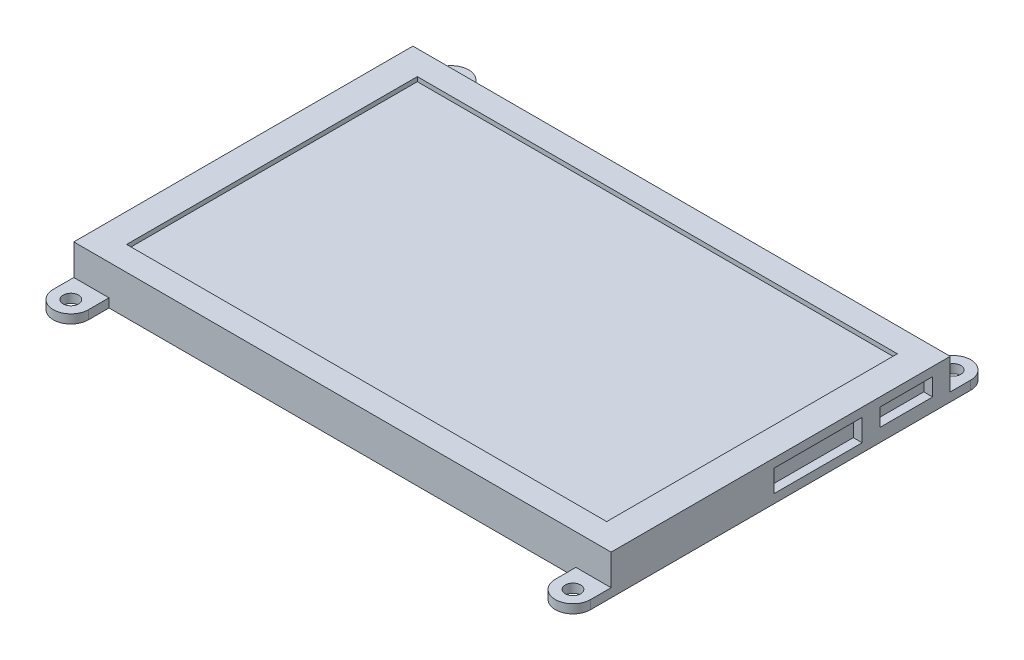
ISO-10303-21;
HEADER;
FILE_DESCRIPTION(('STEP AP214'),'2;1');
FILE_NAME('part.step','',(''),(''),'','','');
FILE_SCHEMA(('AUTOMOTIVE_DESIGN { 1 0 10303 214 1 1 1 1 }'));
ENDSEC;
DATA;
#1=APPLICATION_CONTEXT('core data for automotive mechanical design processes');
#2=APPLICATION_PROTOCOL_DEFINITION('international standard','automotive_design',2000,#1);
#3=PRODUCT_CONTEXT('',#1,'mechanical');
#4=PRODUCT('Part','Part','',(#3));
#5=PRODUCT_RELATED_PRODUCT_CATEGORY('part','',(#4));
#6=PRODUCT_DEFINITION_FORMATION('','',#4);
#7=PRODUCT_DEFINITION_CONTEXT('part definition',#1,'design');
#8=PRODUCT_DEFINITION('design','',#6,#7);
#9=PRODUCT_DEFINITION_SHAPE('','',#8);
#10=(LENGTH_UNIT() NAMED_UNIT(*) SI_UNIT(.MILLI.,.METRE.));
#11=(NAMED_UNIT(*) PLANE_ANGLE_UNIT() SI_UNIT($,.RADIAN.));
#12=(NAMED_UNIT(*) SI_UNIT($,.STERADIAN.) SOLID_ANGLE_UNIT());
#13=UNCERTAINTY_MEASURE_WITH_UNIT(LENGTH_MEASURE(1.E-05),#10,'distance_accuracy_value','');
#14=(GEOMETRIC_REPRESENTATION_CONTEXT(3) GLOBAL_UNCERTAINTY_ASSIGNED_CONTEXT((#13)) GLOBAL_UNIT_ASSIGNED_CONTEXT((#10,
#11,#12)) REPRESENTATION_CONTEXT('',''));
#15=CARTESIAN_POINT('',(0.,0.,0.));
#16=DIRECTION('',(0.,0.,1.));
#17=DIRECTION('',(1.,0.,0.));
#18=AXIS2_PLACEMENT_3D('',#15,#16,#17);
#19=CARTESIAN_POINT('',(0.,0.,0.));
#20=DIRECTION('',(0.,-1.,0.));
#21=DIRECTION('',(0.,0.,-1.));
#22=AXIS2_PLACEMENT_3D('',#19,#20,#21);
#23=PLANE('',#22);
#24=CARTESIAN_POINT('',(118.,0.,4.66000000000003));
#25=DIRECTION('',(0.,-1.,0.));
#26=DIRECTION('',(0.,0.,-1.));
#27=AXIS2_PLACEMENT_3D('',#24,#25,#26);
#28=CIRCLE('',#27,1.75);
#29=CARTESIAN_POINT('',(118.,0.,2.91000000000003));
#30=VERTEX_POINT('',#29);
#31=EDGE_CURVE('E289',#30,#30,#28,.T.);
#32=ORIENTED_EDGE('',*,*,#31,.F.);
#33=EDGE_LOOP('',(#32));
#34=FACE_BOUND('',#33,.T.);
#35=CARTESIAN_POINT('',(118.,0.,-81.66));
#36=DIRECTION('',(0.,-1.,0.));
#37=DIRECTION('',(0.,0.,1.));
#38=AXIS2_PLACEMENT_3D('',#35,#36,#37);
#39=CIRCLE('',#38,4.);
#40=CARTESIAN_POINT('',(114.,0.,-81.66));
#41=VERTEX_POINT('',#40);
#42=CARTESIAN_POINT('',(122.,0.,-81.66));
#43=VERTEX_POINT('',#42);
#44=EDGE_CURVE('E348',#41,#43,#39,.T.);
#45=ORIENTED_EDGE('',*,*,#44,.T.);
#46=DIRECTION('',(0.,0.,-1.));
#47=VECTOR('',#46,1.);
#48=CARTESIAN_POINT('',(122.,0.,0.));
#49=LINE('',#48,#47);
#50=CARTESIAN_POINT('',(122.,0.,4.66));
#51=VERTEX_POINT('',#50);
#52=EDGE_CURVE('E439',#51,#43,#49,.T.);
#53=ORIENTED_EDGE('',*,*,#52,.F.);
#54=CARTESIAN_POINT('',(118.,0.,4.65999999999999));
#55=DIRECTION('',(0.,-1.,0.));
#56=DIRECTION('',(0.,0.,-1.));
#57=AXIS2_PLACEMENT_3D('',#54,#55,#56);
#58=CIRCLE('',#57,4.);
#59=CARTESIAN_POINT('',(114.,0.,4.66));
#60=VERTEX_POINT('',#59);
#61=EDGE_CURVE('E312',#51,#60,#58,.T.);
#62=ORIENTED_EDGE('',*,*,#61,.T.);
#63=DIRECTION('',(0.,0.,-1.));
#64=VECTOR('',#63,1.);
#65=CARTESIAN_POINT('',(114.,0.,4.66));
#66=LINE('',#65,#64);
#67=CARTESIAN_POINT('',(114.,0.,0.));
#68=VERTEX_POINT('',#67);
#69=EDGE_CURVE('E306',#60,#68,#66,.T.);
#70=ORIENTED_EDGE('',*,*,#69,.T.);
#71=DIRECTION('',(1.,0.,0.));
#72=VECTOR('',#71,1.);
#73=CARTESIAN_POINT('',(0.,0.,0.));
#74=LINE('',#73,#72);
#75=CARTESIAN_POINT('',(8.,0.,0.));
#76=VERTEX_POINT('',#75);
#77=EDGE_CURVE('E427',#76,#68,#74,.T.);
#78=ORIENTED_EDGE('',*,*,#77,.F.);
#79=DIRECTION('',(0.,0.,1.));
#80=VECTOR('',#79,1.);
#81=CARTESIAN_POINT('',(8.,0.,4.66));
#82=LINE('',#81,#80);
#83=CARTESIAN_POINT('',(8.,0.,4.66));
#84=VERTEX_POINT('',#83);
#85=EDGE_CURVE('E331',#76,#84,#82,.T.);
#86=ORIENTED_EDGE('',*,*,#85,.T.);
#87=CARTESIAN_POINT('',(4.,0.,4.66));
#88=DIRECTION('',(0.,-1.,0.));
#89=DIRECTION('',(0.,0.,1.));
#90=AXIS2_PLACEMENT_3D('',#87,#88,#89);
#91=CIRCLE('',#90,4.);
#92=CARTESIAN_POINT('',(0.,0.,4.66));
#93=VERTEX_POINT('',#92);
#94=EDGE_CURVE('E326',#84,#93,#91,.T.);
#95=ORIENTED_EDGE('',*,*,#94,.T.);
#96=DIRECTION('',(0.,0.,-1.));
#97=VECTOR('',#96,1.);
#98=CARTESIAN_POINT('',(0.,0.,0.));
#99=LINE('',#98,#97);
#100=CARTESIAN_POINT('',(0.,0.,-81.66));
#101=VERTEX_POINT('',#100);
#102=EDGE_CURVE('E416',#93,#101,#99,.T.);
#103=ORIENTED_EDGE('',*,*,#102,.T.);
#104=CARTESIAN_POINT('',(4.,0.,-81.66));
#105=DIRECTION('',(0.,-1.,0.));
#106=DIRECTION('',(0.,0.,-1.));
#107=AXIS2_PLACEMENT_3D('',#104,#105,#106);
#108=CIRCLE('',#107,4.);
#109=CARTESIAN_POINT('',(8.00000000000001,0.,-81.66));
#110=VERTEX_POINT('',#109);
#111=EDGE_CURVE('E369',#101,#110,#108,.T.);
#112=ORIENTED_EDGE('',*,*,#111,.T.);
#113=DIRECTION('',(0.,0.,1.));
#114=VECTOR('',#113,1.);
#115=CARTESIAN_POINT('',(8.00000000000001,0.,-81.66));
#116=LINE('',#115,#114);
#117=CARTESIAN_POINT('',(8.,0.,-77.));
#118=VERTEX_POINT('',#117);
#119=EDGE_CURVE('E374',#110,#118,#116,.T.);
#120=ORIENTED_EDGE('',*,*,#119,.T.);
#121=DIRECTION('',(1.,0.,0.));
#122=VECTOR('',#121,1.);
#123=CARTESIAN_POINT('',(0.,0.,-77.));
#124=LINE('',#123,#122);
#125=CARTESIAN_POINT('',(114.,0.,-77.));
#126=VERTEX_POINT('',#125);
#127=EDGE_CURVE('E436',#118,#126,#124,.T.);
#128=ORIENTED_EDGE('',*,*,#127,.T.);
#129=DIRECTION('',(0.,0.,-1.));
#130=VECTOR('',#129,1.);
#131=CARTESIAN_POINT('',(114.,0.,-81.66));
#132=LINE('',#131,#130);
#133=EDGE_CURVE('E353',#126,#41,#132,.T.);
#134=ORIENTED_EDGE('',*,*,#133,.T.);
#135=EDGE_LOOP('',(#45,#53,#62,#70,#78,#86,#95,#103,#112,#120,#128,#134));
#136=FACE_BOUND('',#135,.T.);
#137=CARTESIAN_POINT('',(118.,0.,-81.66));
#138=DIRECTION('',(0.,1.,0.));
#139=DIRECTION('',(0.,0.,1.));
#140=AXIS2_PLACEMENT_3D('',#137,#138,#139);
#141=CIRCLE('',#140,1.75);
#142=CARTESIAN_POINT('',(118.,0.,-79.91));
#143=VERTEX_POINT('',#142);
#144=EDGE_CURVE('E298',#143,#143,#141,.T.);
#145=ORIENTED_EDGE('',*,*,#144,.T.);
#146=EDGE_LOOP('',(#145));
#147=FACE_BOUND('',#146,.T.);
#148=CARTESIAN_POINT('',(4.,0.,-81.66));
#149=DIRECTION('',(0.,-1.,0.));
#150=DIRECTION('',(0.,0.,-1.));
#151=AXIS2_PLACEMENT_3D('',#148,#149,#150);
#152=CIRCLE('',#151,1.75);
#153=CARTESIAN_POINT('',(4.,0.,-83.41));
#154=VERTEX_POINT('',#153);
#155=EDGE_CURVE('E283',#154,#154,#152,.T.);
#156=ORIENTED_EDGE('',*,*,#155,.F.);
#157=EDGE_LOOP('',(#156));
#158=FACE_BOUND('',#157,.T.);
#159=CARTESIAN_POINT('',(4.,0.,4.66));
#160=DIRECTION('',(0.,1.,0.));
#161=DIRECTION('',(0.,0.,1.));
#162=AXIS2_PLACEMENT_3D('',#159,#160,#161);
#163=CIRCLE('',#162,1.75);
#164=CARTESIAN_POINT('',(4.,0.,6.41));
#165=VERTEX_POINT('',#164);
#166=EDGE_CURVE('E293',#165,#165,#163,.T.);
#167=ORIENTED_EDGE('',*,*,#166,.T.);
#168=EDGE_LOOP('',(#167));
#169=FACE_BOUND('',#168,.T.);
#170=ADVANCED_FACE('F34',(#34,#136,#147,#158,#169),#23,.T.);
#171=CARTESIAN_POINT('',(0.,9.,0.));
#172=DIRECTION('',(-1.,0.,0.));
#173=DIRECTION('',(0.,0.,1.));
#174=AXIS2_PLACEMENT_3D('',#171,#172,#173);
#175=PLANE('',#174);
#176=DIRECTION('',(0.,-1.,0.));
#177=VECTOR('',#176,1.);
#178=CARTESIAN_POINT('',(0.,2.,-81.66));
#179=LINE('',#178,#177);
#180=CARTESIAN_POINT('',(0.,2.,-81.66));
#181=VERTEX_POINT('',#180);
#182=EDGE_CURVE('E383',#181,#101,#179,.T.);
#183=ORIENTED_EDGE('',*,*,#182,.T.);
#184=ORIENTED_EDGE('',*,*,#102,.F.);
#185=DIRECTION('',(0.,-1.,0.));
#186=VECTOR('',#185,1.);
#187=CARTESIAN_POINT('',(0.,2.,4.66));
#188=LINE('',#187,#186);
#189=CARTESIAN_POINT('',(0.,2.,4.66));
#190=VERTEX_POINT('',#189);
#191=EDGE_CURVE('E336',#190,#93,#188,.T.);
#192=ORIENTED_EDGE('',*,*,#191,.F.);
#193=DIRECTION('',(0.,0.,-1.));
#194=VECTOR('',#193,1.);
#195=CARTESIAN_POINT('',(0.,2.,4.66));
#196=LINE('',#195,#194);
#197=CARTESIAN_POINT('',(0.,2.,0.));
#198=VERTEX_POINT('',#197);
#199=EDGE_CURVE('E330',#190,#198,#196,.T.);
#200=ORIENTED_EDGE('',*,*,#199,.T.);
#201=DIRECTION('',(0.,-1.,0.));
#202=VECTOR('',#201,1.);
#203=CARTESIAN_POINT('',(0.,9.,0.));
#204=LINE('',#203,#202);
#205=CARTESIAN_POINT('',(0.,9.,0.));
#206=VERTEX_POINT('',#205);
#207=EDGE_CURVE('E442',#206,#198,#204,.T.);
#208=ORIENTED_EDGE('',*,*,#207,.F.);
#209=DIRECTION('',(0.,0.,-1.));
#210=VECTOR('',#209,1.);
#211=CARTESIAN_POINT('',(0.,9.,0.));
#212=LINE('',#211,#210);
#213=CARTESIAN_POINT('',(0.,9.,-77.));
#214=VERTEX_POINT('',#213);
#215=EDGE_CURVE('E423',#206,#214,#212,.T.);
#216=ORIENTED_EDGE('',*,*,#215,.T.);
#217=DIRECTION('',(0.,-1.,0.));
#218=VECTOR('',#217,1.);
#219=CARTESIAN_POINT('',(0.,9.,-77.));
#220=LINE('',#219,#218);
#221=CARTESIAN_POINT('',(0.,2.,-77.));
#222=VERTEX_POINT('',#221);
#223=EDGE_CURVE('E434',#214,#222,#220,.T.);
#224=ORIENTED_EDGE('',*,*,#223,.T.);
#225=DIRECTION('',(0.,0.,-1.));
#226=VECTOR('',#225,1.);
#227=CARTESIAN_POINT('',(0.,2.,-81.66));
#228=LINE('',#227,#226);
#229=EDGE_CURVE('E377',#222,#181,#228,.T.);
#230=ORIENTED_EDGE('',*,*,#229,.T.);
#231=EDGE_LOOP('',(#183,#184,#192,#200,#208,#216,#224,#230));
#232=FACE_BOUND('',#231,.T.);
#233=ADVANCED_FACE('F36',(#232),#175,.T.);
#234=CARTESIAN_POINT('',(0.,9.,0.));
#235=DIRECTION('',(0.,0.,-1.));
#236=DIRECTION('',(-1.,0.,0.));
#237=AXIS2_PLACEMENT_3D('',#234,#235,#236);
#238=PLANE('',#237);
#239=ORIENTED_EDGE('',*,*,#77,.T.);
#240=DIRECTION('',(0.,1.,0.));
#241=VECTOR('',#240,1.);
#242=CARTESIAN_POINT('',(114.,9.,0.));
#243=LINE('',#242,#241);
#244=CARTESIAN_POINT('',(114.,2.,0.));
#245=VERTEX_POINT('',#244);
#246=EDGE_CURVE('E320',#68,#245,#243,.T.);
#247=ORIENTED_EDGE('',*,*,#246,.T.);
#248=DIRECTION('',(-1.,0.,0.));
#249=VECTOR('',#248,1.);
#250=CARTESIAN_POINT('',(0.,2.,0.));
#251=LINE('',#250,#249);
#252=CARTESIAN_POINT('',(122.,2.,0.));
#253=VERTEX_POINT('',#252);
#254=EDGE_CURVE('E323',#253,#245,#251,.T.);
#255=ORIENTED_EDGE('',*,*,#254,.F.);
#256=DIRECTION('',(0.,-1.,0.));
#257=VECTOR('',#256,1.);
#258=CARTESIAN_POINT('',(122.,9.,0.));
#259=LINE('',#258,#257);
#260=CARTESIAN_POINT('',(122.,9.,0.));
#261=VERTEX_POINT('',#260);
#262=EDGE_CURVE('E445',#261,#253,#259,.T.);
#263=ORIENTED_EDGE('',*,*,#262,.F.);
#264=DIRECTION('',(1.,0.,0.));
#265=VECTOR('',#264,1.);
#266=CARTESIAN_POINT('',(0.,9.,0.));
#267=LINE('',#266,#265);
#268=EDGE_CURVE('E432',#206,#261,#267,.T.);
#269=ORIENTED_EDGE('',*,*,#268,.F.);
#270=ORIENTED_EDGE('',*,*,#207,.T.);
#271=DIRECTION('',(1.,0.,0.));
#272=VECTOR('',#271,1.);
#273=CARTESIAN_POINT('',(0.,2.,0.));
#274=LINE('',#273,#272);
#275=CARTESIAN_POINT('',(8.,2.,0.));
#276=VERTEX_POINT('',#275);
#277=EDGE_CURVE('E11',#198,#276,#274,.T.);
#278=ORIENTED_EDGE('',*,*,#277,.T.);
#279=DIRECTION('',(0.,-1.,0.));
#280=VECTOR('',#279,1.);
#281=CARTESIAN_POINT('',(8.,9.,0.));
#282=LINE('',#281,#280);
#283=EDGE_CURVE('E343',#276,#76,#282,.T.);
#284=ORIENTED_EDGE('',*,*,#283,.T.);
#285=EDGE_LOOP('',(#239,#247,#255,#263,#269,#270,#278,#284));
#286=FACE_BOUND('',#285,.T.);
#287=ADVANCED_FACE('F491',(#286),#238,.F.);
#288=CARTESIAN_POINT('',(122.,9.,0.));
#289=DIRECTION('',(-1.,0.,0.));
#290=DIRECTION('',(0.,0.,1.));
#291=AXIS2_PLACEMENT_3D('',#288,#289,#290);
#292=PLANE('',#291);
#293=DIRECTION('',(0.,0.,-1.));
#294=VECTOR('',#293,1.);
#295=CARTESIAN_POINT('',(122.,2.,-57.));
#296=LINE('',#295,#294);
#297=CARTESIAN_POINT('',(122.,2.,-37.));
#298=VERTEX_POINT('',#297);
#299=CARTESIAN_POINT('',(122.,2.,-57.));
#300=VERTEX_POINT('',#299);
#301=EDGE_CURVE('E249',#298,#300,#296,.T.);
#302=ORIENTED_EDGE('',*,*,#301,.F.);
#303=DIRECTION('',(0.,-1.,0.));
#304=VECTOR('',#303,1.);
#305=CARTESIAN_POINT('',(122.,7.,-37.));
#306=LINE('',#305,#304);
#307=CARTESIAN_POINT('',(122.,7.,-37.));
#308=VERTEX_POINT('',#307);
#309=EDGE_CURVE('E51',#308,#298,#306,.T.);
#310=ORIENTED_EDGE('',*,*,#309,.F.);
#311=DIRECTION('',(0.,0.,1.));
#312=VECTOR('',#311,1.);
#313=CARTESIAN_POINT('',(122.,7.,-57.));
#314=LINE('',#313,#312);
#315=CARTESIAN_POINT('',(122.,7.,-57.));
#316=VERTEX_POINT('',#315);
#317=EDGE_CURVE('E240',#316,#308,#314,.T.);
#318=ORIENTED_EDGE('',*,*,#317,.F.);
#319=DIRECTION('',(0.,1.,0.));
#320=VECTOR('',#319,1.);
#321=CARTESIAN_POINT('',(122.,7.,-57.));
#322=LINE('',#321,#320);
#323=EDGE_CURVE('E243',#300,#316,#322,.T.);
#324=ORIENTED_EDGE('',*,*,#323,.F.);
#325=EDGE_LOOP('',(#302,#310,#318,#324));
#326=FACE_BOUND('',#325,.T.);
#327=DIRECTION('',(0.,0.,-1.));
#328=VECTOR('',#327,1.);
#329=CARTESIAN_POINT('',(122.,3.,-73.));
#330=LINE('',#329,#328);
#331=CARTESIAN_POINT('',(122.,3.,-61.));
#332=VERTEX_POINT('',#331);
#333=CARTESIAN_POINT('',(122.,3.,-73.));
#334=VERTEX_POINT('',#333);
#335=EDGE_CURVE('E273',#332,#334,#330,.T.);
#336=ORIENTED_EDGE('',*,*,#335,.F.);
#337=DIRECTION('',(0.,-1.,0.));
#338=VECTOR('',#337,1.);
#339=CARTESIAN_POINT('',(122.,6.99999999999999,-61.));
#340=LINE('',#339,#338);
#341=CARTESIAN_POINT('',(122.,6.99999999999999,-61.));
#342=VERTEX_POINT('',#341);
#343=EDGE_CURVE('E59',#342,#332,#340,.T.);
#344=ORIENTED_EDGE('',*,*,#343,.F.);
#345=DIRECTION('',(0.,0.,1.));
#346=VECTOR('',#345,1.);
#347=CARTESIAN_POINT('',(122.,7.,-73.));
#348=LINE('',#347,#346);
#349=CARTESIAN_POINT('',(122.,7.,-73.));
#350=VERTEX_POINT('',#349);
#351=EDGE_CURVE('E262',#350,#342,#348,.T.);
#352=ORIENTED_EDGE('',*,*,#351,.F.);
#353=DIRECTION('',(0.,1.,0.));
#354=VECTOR('',#353,1.);
#355=CARTESIAN_POINT('',(122.,7.,-73.));
#356=LINE('',#355,#354);
#357=EDGE_CURVE('E276',#334,#350,#356,.T.);
#358=ORIENTED_EDGE('',*,*,#357,.F.);
#359=EDGE_LOOP('',(#336,#344,#352,#358));
#360=FACE_BOUND('',#359,.T.);
#361=ORIENTED_EDGE('',*,*,#52,.T.);
#362=DIRECTION('',(0.,-1.,0.));
#363=VECTOR('',#362,1.);
#364=CARTESIAN_POINT('',(122.,2.,-81.66));
#365=LINE('',#364,#363);
#366=CARTESIAN_POINT('',(122.,2.,-81.66));
#367=VERTEX_POINT('',#366);
#368=EDGE_CURVE('E358',#367,#43,#365,.T.);
#369=ORIENTED_EDGE('',*,*,#368,.F.);
#370=DIRECTION('',(0.,0.,1.));
#371=VECTOR('',#370,1.);
#372=CARTESIAN_POINT('',(122.,2.,-81.66));
#373=LINE('',#372,#371);
#374=CARTESIAN_POINT('',(122.,2.,-77.));
#375=VERTEX_POINT('',#374);
#376=EDGE_CURVE('E352',#367,#375,#373,.T.);
#377=ORIENTED_EDGE('',*,*,#376,.T.);
#378=DIRECTION('',(0.,-1.,0.));
#379=VECTOR('',#378,1.);
#380=CARTESIAN_POINT('',(122.,9.,-77.));
#381=LINE('',#380,#379);
#382=CARTESIAN_POINT('',(122.,9.,-77.));
#383=VERTEX_POINT('',#382);
#384=EDGE_CURVE('E448',#383,#375,#381,.T.);
#385=ORIENTED_EDGE('',*,*,#384,.F.);
#386=DIRECTION('',(0.,0.,-1.));
#387=VECTOR('',#386,1.);
#388=CARTESIAN_POINT('',(122.,9.,0.));
#389=LINE('',#388,#387);
#390=EDGE_CURVE('E430',#261,#383,#389,.T.);
#391=ORIENTED_EDGE('',*,*,#390,.F.);
#392=ORIENTED_EDGE('',*,*,#262,.T.);
#393=DIRECTION('',(0.,0.,1.));
#394=VECTOR('',#393,1.);
#395=CARTESIAN_POINT('',(122.,2.,4.66));
#396=LINE('',#395,#394);
#397=CARTESIAN_POINT('',(122.,2.,4.66));
#398=VERTEX_POINT('',#397);
#399=EDGE_CURVE('E309',#253,#398,#396,.T.);
#400=ORIENTED_EDGE('',*,*,#399,.T.);
#401=DIRECTION('',(0.,-1.,0.));
#402=VECTOR('',#401,1.);
#403=CARTESIAN_POINT('',(122.,2.,4.66));
#404=LINE('',#403,#402);
#405=EDGE_CURVE('E317',#398,#51,#404,.T.);
#406=ORIENTED_EDGE('',*,*,#405,.T.);
#407=EDGE_LOOP('',(#361,#369,#377,#385,#391,#392,#400,#406));
#408=FACE_BOUND('',#407,.T.);
#409=ADVANCED_FACE('F501',(#326,#360,#408),#292,.F.);
#410=CARTESIAN_POINT('',(0.,9.,-77.));
#411=DIRECTION('',(0.,0.,-1.));
#412=DIRECTION('',(-1.,0.,0.));
#413=AXIS2_PLACEMENT_3D('',#410,#411,#412);
#414=PLANE('',#413);
#415=DIRECTION('',(0.,1.,0.));
#416=VECTOR('',#415,1.);
#417=CARTESIAN_POINT('',(114.,9.,-77.));
#418=LINE('',#417,#416);
#419=CARTESIAN_POINT('',(114.,2.,-77.));
#420=VERTEX_POINT('',#419);
#421=EDGE_CURVE('E365',#126,#420,#418,.T.);
#422=ORIENTED_EDGE('',*,*,#421,.F.);
#423=ORIENTED_EDGE('',*,*,#127,.F.);
#424=DIRECTION('',(0.,-1.,0.));
#425=VECTOR('',#424,1.);
#426=CARTESIAN_POINT('',(8.00000000000001,9.,-77.));
#427=LINE('',#426,#425);
#428=CARTESIAN_POINT('',(8.00000000000001,2.,-77.));
#429=VERTEX_POINT('',#428);
#430=EDGE_CURVE('E386',#429,#118,#427,.T.);
#431=ORIENTED_EDGE('',*,*,#430,.F.);
#432=DIRECTION('',(-1.,0.,0.));
#433=VECTOR('',#432,1.);
#434=CARTESIAN_POINT('',(0.,2.,-77.));
#435=LINE('',#434,#433);
#436=EDGE_CURVE('E444',#429,#222,#435,.T.);
#437=ORIENTED_EDGE('',*,*,#436,.T.);
#438=ORIENTED_EDGE('',*,*,#223,.F.);
#439=DIRECTION('',(1.,0.,0.));
#440=VECTOR('',#439,1.);
#441=CARTESIAN_POINT('',(0.,9.,-77.));
#442=LINE('',#441,#440);
#443=EDGE_CURVE('E426',#214,#383,#442,.T.);
#444=ORIENTED_EDGE('',*,*,#443,.T.);
#445=ORIENTED_EDGE('',*,*,#384,.T.);
#446=DIRECTION('',(1.,0.,0.));
#447=VECTOR('',#446,1.);
#448=CARTESIAN_POINT('',(0.,2.,-77.));
#449=LINE('',#448,#447);
#450=EDGE_CURVE('E43',#420,#375,#449,.T.);
#451=ORIENTED_EDGE('',*,*,#450,.F.);
#452=EDGE_LOOP('',(#422,#423,#431,#437,#438,#444,#445,#451));
#453=FACE_BOUND('',#452,.T.);
#454=ADVANCED_FACE('F504',(#453),#414,.T.);
#455=CARTESIAN_POINT('',(0.,9.,0.));
#456=DIRECTION('',(0.,-1.,0.));
#457=DIRECTION('',(0.,0.,-1.));
#458=AXIS2_PLACEMENT_3D('',#455,#456,#457);
#459=PLANE('',#458);
#460=DIRECTION('',(-1.,0.,0.));
#461=VECTOR('',#460,1.);
#462=CARTESIAN_POINT('',(6.49999999999998,9.,-71.5));
#463=LINE('',#462,#461);
#464=CARTESIAN_POINT('',(115.5,9.,-71.5));
#465=VERTEX_POINT('',#464);
#466=CARTESIAN_POINT('',(6.49999999999998,9.,-71.5));
#467=VERTEX_POINT('',#466);
#468=EDGE_CURVE('E406',#465,#467,#463,.T.);
#469=ORIENTED_EDGE('',*,*,#468,.F.);
#470=DIRECTION('',(0.,0.,-1.));
#471=VECTOR('',#470,1.);
#472=CARTESIAN_POINT('',(115.5,9.,-71.5));
#473=LINE('',#472,#471);
#474=CARTESIAN_POINT('',(115.5,9.,-5.50000000000001));
#475=VERTEX_POINT('',#474);
#476=EDGE_CURVE('E390',#475,#465,#473,.T.);
#477=ORIENTED_EDGE('',*,*,#476,.F.);
#478=DIRECTION('',(1.,0.,0.));
#479=VECTOR('',#478,1.);
#480=CARTESIAN_POINT('',(6.49999999999999,9.,-5.50000000000001));
#481=LINE('',#480,#479);
#482=CARTESIAN_POINT('',(6.49999999999999,9.,-5.50000000000001));
#483=VERTEX_POINT('',#482);
#484=EDGE_CURVE('E395',#483,#475,#481,.T.);
#485=ORIENTED_EDGE('',*,*,#484,.F.);
#486=DIRECTION('',(0.,0.,1.));
#487=VECTOR('',#486,1.);
#488=CARTESIAN_POINT('',(6.49999999999998,9.,-71.5));
#489=LINE('',#488,#487);
#490=EDGE_CURVE('E409',#467,#483,#489,.T.);
#491=ORIENTED_EDGE('',*,*,#490,.F.);
#492=EDGE_LOOP('',(#469,#477,#485,#491));
#493=FACE_BOUND('',#492,.T.);
#494=ORIENTED_EDGE('',*,*,#215,.F.);
#495=ORIENTED_EDGE('',*,*,#268,.T.);
#496=ORIENTED_EDGE('',*,*,#390,.T.);
#497=ORIENTED_EDGE('',*,*,#443,.F.);
#498=EDGE_LOOP('',(#494,#495,#496,#497));
#499=FACE_BOUND('',#498,.T.);
#500=ADVANCED_FACE('F497',(#493,#499),#459,.F.);
#501=CARTESIAN_POINT('',(115.5,8.,-71.5));
#502=DIRECTION('',(1.,0.,0.));
#503=DIRECTION('',(0.,0.,-1.));
#504=AXIS2_PLACEMENT_3D('',#501,#502,#503);
#505=PLANE('',#504);
#506=ORIENTED_EDGE('',*,*,#476,.T.);
#507=DIRECTION('',(0.,1.,0.));
#508=VECTOR('',#507,1.);
#509=CARTESIAN_POINT('',(115.5,8.,-71.5));
#510=LINE('',#509,#508);
#511=CARTESIAN_POINT('',(115.5,8.,-71.5));
#512=VERTEX_POINT('',#511);
#513=EDGE_CURVE('E404',#512,#465,#510,.T.);
#514=ORIENTED_EDGE('',*,*,#513,.F.);
#515=DIRECTION('',(0.,0.,-1.));
#516=VECTOR('',#515,1.);
#517=CARTESIAN_POINT('',(115.5,8.,-71.5));
#518=LINE('',#517,#516);
#519=CARTESIAN_POINT('',(115.5,8.,-5.50000000000001));
#520=VERTEX_POINT('',#519);
#521=EDGE_CURVE('E391',#520,#512,#518,.T.);
#522=ORIENTED_EDGE('',*,*,#521,.F.);
#523=DIRECTION('',(0.,1.,0.));
#524=VECTOR('',#523,1.);
#525=CARTESIAN_POINT('',(115.5,8.,-5.50000000000001));
#526=LINE('',#525,#524);
#527=EDGE_CURVE('E414',#520,#475,#526,.T.);
#528=ORIENTED_EDGE('',*,*,#527,.T.);
#529=EDGE_LOOP('',(#506,#514,#522,#528));
#530=FACE_BOUND('',#529,.T.);
#531=ADVANCED_FACE('F511',(#530),#505,.F.);
#532=CARTESIAN_POINT('',(6.49999999999999,8.,-5.50000000000001));
#533=DIRECTION('',(0.,0.,1.));
#534=DIRECTION('',(1.,0.,0.));
#535=AXIS2_PLACEMENT_3D('',#532,#533,#534);
#536=PLANE('',#535);
#537=ORIENTED_EDGE('',*,*,#484,.T.);
#538=ORIENTED_EDGE('',*,*,#527,.F.);
#539=DIRECTION('',(1.,0.,0.));
#540=VECTOR('',#539,1.);
#541=CARTESIAN_POINT('',(6.49999999999999,8.,-5.50000000000001));
#542=LINE('',#541,#540);
#543=CARTESIAN_POINT('',(6.49999999999999,8.,-5.50000000000001));
#544=VERTEX_POINT('',#543);
#545=EDGE_CURVE('E401',#544,#520,#542,.T.);
#546=ORIENTED_EDGE('',*,*,#545,.F.);
#547=DIRECTION('',(0.,1.,0.));
#548=VECTOR('',#547,1.);
#549=CARTESIAN_POINT('',(6.49999999999999,8.,-5.50000000000001));
#550=LINE('',#549,#548);
#551=EDGE_CURVE('E417',#544,#483,#550,.T.);
#552=ORIENTED_EDGE('',*,*,#551,.T.);
#553=EDGE_LOOP('',(#537,#538,#546,#552));
#554=FACE_BOUND('',#553,.T.);
#555=ADVANCED_FACE('F568',(#554),#536,.F.);
#556=CARTESIAN_POINT('',(6.49999999999998,8.,-71.5));
#557=DIRECTION('',(-1.,0.,0.));
#558=DIRECTION('',(0.,0.,1.));
#559=AXIS2_PLACEMENT_3D('',#556,#557,#558);
#560=PLANE('',#559);
#561=ORIENTED_EDGE('',*,*,#490,.T.);
#562=ORIENTED_EDGE('',*,*,#551,.F.);
#563=DIRECTION('',(0.,0.,1.));
#564=VECTOR('',#563,1.);
#565=CARTESIAN_POINT('',(6.49999999999998,8.,-71.5));
#566=LINE('',#565,#564);
#567=CARTESIAN_POINT('',(6.49999999999998,8.,-71.5));
#568=VERTEX_POINT('',#567);
#569=EDGE_CURVE('E398',#568,#544,#566,.T.);
#570=ORIENTED_EDGE('',*,*,#569,.F.);
#571=DIRECTION('',(0.,1.,0.));
#572=VECTOR('',#571,1.);
#573=CARTESIAN_POINT('',(6.49999999999998,8.,-71.5));
#574=LINE('',#573,#572);
#575=EDGE_CURVE('E419',#568,#467,#574,.T.);
#576=ORIENTED_EDGE('',*,*,#575,.T.);
#577=EDGE_LOOP('',(#561,#562,#570,#576));
#578=FACE_BOUND('',#577,.T.);
#579=ADVANCED_FACE('F571',(#578),#560,.F.);
#580=CARTESIAN_POINT('',(6.49999999999998,8.,-71.5));
#581=DIRECTION('',(0.,0.,-1.));
#582=DIRECTION('',(-1.,0.,0.));
#583=AXIS2_PLACEMENT_3D('',#580,#581,#582);
#584=PLANE('',#583);
#585=ORIENTED_EDGE('',*,*,#468,.T.);
#586=ORIENTED_EDGE('',*,*,#575,.F.);
#587=DIRECTION('',(-1.,0.,0.));
#588=VECTOR('',#587,1.);
#589=CARTESIAN_POINT('',(6.49999999999998,8.,-71.5));
#590=LINE('',#589,#588);
#591=EDGE_CURVE('E394',#512,#568,#590,.T.);
#592=ORIENTED_EDGE('',*,*,#591,.F.);
#593=ORIENTED_EDGE('',*,*,#513,.T.);
#594=EDGE_LOOP('',(#585,#586,#592,#593));
#595=FACE_BOUND('',#594,.T.);
#596=ADVANCED_FACE('F566',(#595),#584,.F.);
#597=CARTESIAN_POINT('',(0.,8.,0.));
#598=DIRECTION('',(0.,1.,0.));
#599=DIRECTION('',(0.,0.,1.));
#600=AXIS2_PLACEMENT_3D('',#597,#598,#599);
#601=PLANE('',#600);
#602=ORIENTED_EDGE('',*,*,#521,.T.);
#603=ORIENTED_EDGE('',*,*,#591,.T.);
#604=ORIENTED_EDGE('',*,*,#569,.T.);
#605=ORIENTED_EDGE('',*,*,#545,.T.);
#606=EDGE_LOOP('',(#602,#603,#604,#605));
#607=FACE_BOUND('',#606,.T.);
#608=ADVANCED_FACE('F562',(#607),#601,.T.);
#609=CARTESIAN_POINT('',(4.,2.,-81.66));
#610=DIRECTION('',(0.,-1.,0.));
#611=DIRECTION('',(0.,0.,-1.));
#612=AXIS2_PLACEMENT_3D('',#609,#610,#611);
#613=CYLINDRICAL_SURFACE('',#612,4.);
#614=ORIENTED_EDGE('',*,*,#111,.F.);
#615=ORIENTED_EDGE('',*,*,#182,.F.);
#616=CARTESIAN_POINT('',(4.,2.,-81.66));
#617=DIRECTION('',(0.,-1.,0.));
#618=DIRECTION('',(0.,0.,-1.));
#619=AXIS2_PLACEMENT_3D('',#616,#617,#618);
#620=CIRCLE('',#619,4.);
#621=CARTESIAN_POINT('',(8.00000000000001,2.,-81.66));
#622=VERTEX_POINT('',#621);
#623=EDGE_CURVE('E370',#181,#622,#620,.T.);
#624=ORIENTED_EDGE('',*,*,#623,.T.);
#625=DIRECTION('',(0.,-1.,0.));
#626=VECTOR('',#625,1.);
#627=CARTESIAN_POINT('',(8.00000000000001,2.,-81.66));
#628=LINE('',#627,#626);
#629=EDGE_CURVE('E379',#622,#110,#628,.T.);
#630=ORIENTED_EDGE('',*,*,#629,.T.);
#631=EDGE_LOOP('',(#614,#615,#624,#630));
#632=FACE_BOUND('',#631,.T.);
#633=ADVANCED_FACE('F559',(#632),#613,.T.);
#634=CARTESIAN_POINT('',(8.00000000000001,2.,-81.66));
#635=DIRECTION('',(1.,0.,0.));
#636=DIRECTION('',(0.,0.,-1.));
#637=AXIS2_PLACEMENT_3D('',#634,#635,#636);
#638=PLANE('',#637);
#639=DIRECTION('',(0.,0.,1.));
#640=VECTOR('',#639,1.);
#641=CARTESIAN_POINT('',(8.00000000000001,2.,-81.66));
#642=LINE('',#641,#640);
#643=EDGE_CURVE('E373',#622,#429,#642,.T.);
#644=ORIENTED_EDGE('',*,*,#643,.T.);
#645=ORIENTED_EDGE('',*,*,#430,.T.);
#646=ORIENTED_EDGE('',*,*,#119,.F.);
#647=ORIENTED_EDGE('',*,*,#629,.F.);
#648=EDGE_LOOP('',(#644,#645,#646,#647));
#649=FACE_BOUND('',#648,.T.);
#650=ADVANCED_FACE('F523',(#649),#638,.T.);
#651=CARTESIAN_POINT('',(4.,2.,-81.66));
#652=DIRECTION('',(0.,-1.,0.));
#653=DIRECTION('',(0.,0.,-1.));
#654=AXIS2_PLACEMENT_3D('',#651,#652,#653);
#655=PLANE('',#654);
#656=CARTESIAN_POINT('',(4.,2.,-81.66));
#657=DIRECTION('',(0.,-1.,0.));
#658=DIRECTION('',(0.,0.,-1.));
#659=AXIS2_PLACEMENT_3D('',#656,#657,#658);
#660=CIRCLE('',#659,1.75);
#661=CARTESIAN_POINT('',(4.,2.,-83.41));
#662=VERTEX_POINT('',#661);
#663=EDGE_CURVE('E38',#662,#662,#660,.T.);
#664=ORIENTED_EDGE('',*,*,#663,.T.);
#665=EDGE_LOOP('',(#664));
#666=FACE_BOUND('',#665,.T.);
#667=ORIENTED_EDGE('',*,*,#436,.F.);
#668=ORIENTED_EDGE('',*,*,#643,.F.);
#669=ORIENTED_EDGE('',*,*,#623,.F.);
#670=ORIENTED_EDGE('',*,*,#229,.F.);
#671=EDGE_LOOP('',(#667,#668,#669,#670));
#672=FACE_BOUND('',#671,.T.);
#673=ADVANCED_FACE('F466',(#666,#672),#655,.F.);
#674=CARTESIAN_POINT('',(118.,2.,-81.66));
#675=DIRECTION('',(0.,-1.,0.));
#676=DIRECTION('',(0.,0.,-1.));
#677=AXIS2_PLACEMENT_3D('',#674,#675,#676);
#678=CYLINDRICAL_SURFACE('',#677,4.);
#679=ORIENTED_EDGE('',*,*,#44,.F.);
#680=DIRECTION('',(0.,-1.,0.));
#681=VECTOR('',#680,1.);
#682=CARTESIAN_POINT('',(114.,2.,-81.66));
#683=LINE('',#682,#681);
#684=CARTESIAN_POINT('',(114.,2.,-81.66));
#685=VERTEX_POINT('',#684);
#686=EDGE_CURVE('E362',#685,#41,#683,.T.);
#687=ORIENTED_EDGE('',*,*,#686,.F.);
#688=CARTESIAN_POINT('',(118.,2.,-81.66));
#689=DIRECTION('',(0.,-1.,0.));
#690=DIRECTION('',(0.,0.,1.));
#691=AXIS2_PLACEMENT_3D('',#688,#689,#690);
#692=CIRCLE('',#691,4.);
#693=EDGE_CURVE('E349',#685,#367,#692,.T.);
#694=ORIENTED_EDGE('',*,*,#693,.T.);
#695=ORIENTED_EDGE('',*,*,#368,.T.);
#696=EDGE_LOOP('',(#679,#687,#694,#695));
#697=FACE_BOUND('',#696,.T.);
#698=ADVANCED_FACE('F541',(#697),#678,.T.);
#699=CARTESIAN_POINT('',(114.,2.,-81.66));
#700=DIRECTION('',(-1.,0.,0.));
#701=DIRECTION('',(0.,0.,1.));
#702=AXIS2_PLACEMENT_3D('',#699,#700,#701);
#703=PLANE('',#702);
#704=ORIENTED_EDGE('',*,*,#133,.F.);
#705=ORIENTED_EDGE('',*,*,#421,.T.);
#706=DIRECTION('',(0.,0.,-1.));
#707=VECTOR('',#706,1.);
#708=CARTESIAN_POINT('',(114.,2.,-81.66));
#709=LINE('',#708,#707);
#710=EDGE_CURVE('E356',#420,#685,#709,.T.);
#711=ORIENTED_EDGE('',*,*,#710,.T.);
#712=ORIENTED_EDGE('',*,*,#686,.T.);
#713=EDGE_LOOP('',(#704,#705,#711,#712));
#714=FACE_BOUND('',#713,.T.);
#715=ADVANCED_FACE('F542',(#714),#703,.T.);
#716=CARTESIAN_POINT('',(118.,2.,-81.66));
#717=DIRECTION('',(0.,1.,0.));
#718=DIRECTION('',(0.,0.,1.));
#719=AXIS2_PLACEMENT_3D('',#716,#717,#718);
#720=PLANE('',#719);
#721=CARTESIAN_POINT('',(118.,2.,-81.66));
#722=DIRECTION('',(0.,1.,0.));
#723=DIRECTION('',(0.,0.,1.));
#724=AXIS2_PLACEMENT_3D('',#721,#722,#723);
#725=CIRCLE('',#724,1.75);
#726=CARTESIAN_POINT('',(118.,2.,-79.91));
#727=VERTEX_POINT('',#726);
#728=EDGE_CURVE('E301',#727,#727,#725,.F.);
#729=ORIENTED_EDGE('',*,*,#728,.T.);
#730=EDGE_LOOP('',(#729));
#731=FACE_BOUND('',#730,.T.);
#732=ORIENTED_EDGE('',*,*,#710,.F.);
#733=ORIENTED_EDGE('',*,*,#450,.T.);
#734=ORIENTED_EDGE('',*,*,#376,.F.);
#735=ORIENTED_EDGE('',*,*,#693,.F.);
#736=EDGE_LOOP('',(#732,#733,#734,#735));
#737=FACE_BOUND('',#736,.T.);
#738=ADVANCED_FACE('F537',(#731,#737),#720,.T.);
#739=CARTESIAN_POINT('',(4.,2.,4.66));
#740=DIRECTION('',(0.,1.,0.));
#741=DIRECTION('',(0.,0.,1.));
#742=AXIS2_PLACEMENT_3D('',#739,#740,#741);
#743=PLANE('',#742);
#744=CARTESIAN_POINT('',(4.,2.,4.66));
#745=DIRECTION('',(0.,1.,0.));
#746=DIRECTION('',(0.,0.,1.));
#747=AXIS2_PLACEMENT_3D('',#744,#745,#746);
#748=CIRCLE('',#747,1.75);
#749=CARTESIAN_POINT('',(4.,2.,6.41));
#750=VERTEX_POINT('',#749);
#751=EDGE_CURVE('E459',#750,#750,#748,.F.);
#752=ORIENTED_EDGE('',*,*,#751,.T.);
#753=EDGE_LOOP('',(#752));
#754=FACE_BOUND('',#753,.T.);
#755=ORIENTED_EDGE('',*,*,#277,.F.);
#756=ORIENTED_EDGE('',*,*,#199,.F.);
#757=CARTESIAN_POINT('',(4.,2.,4.66));
#758=DIRECTION('',(0.,-1.,0.));
#759=DIRECTION('',(0.,0.,1.));
#760=AXIS2_PLACEMENT_3D('',#757,#758,#759);
#761=CIRCLE('',#760,4.);
#762=CARTESIAN_POINT('',(8.,2.,4.66));
#763=VERTEX_POINT('',#762);
#764=EDGE_CURVE('E327',#763,#190,#761,.T.);
#765=ORIENTED_EDGE('',*,*,#764,.F.);
#766=DIRECTION('',(0.,0.,1.));
#767=VECTOR('',#766,1.);
#768=CARTESIAN_POINT('',(8.,2.,4.66));
#769=LINE('',#768,#767);
#770=EDGE_CURVE('E334',#276,#763,#769,.T.);
#771=ORIENTED_EDGE('',*,*,#770,.F.);
#772=EDGE_LOOP('',(#755,#756,#765,#771));
#773=FACE_BOUND('',#772,.T.);
#774=ADVANCED_FACE('F549',(#754,#773),#743,.T.);
#775=CARTESIAN_POINT('',(8.,2.,4.66));
#776=DIRECTION('',(1.,0.,0.));
#777=DIRECTION('',(0.,0.,-1.));
#778=AXIS2_PLACEMENT_3D('',#775,#776,#777);
#779=PLANE('',#778);
#780=ORIENTED_EDGE('',*,*,#283,.F.);
#781=ORIENTED_EDGE('',*,*,#770,.T.);
#782=DIRECTION('',(0.,-1.,0.));
#783=VECTOR('',#782,1.);
#784=CARTESIAN_POINT('',(8.,2.,4.66));
#785=LINE('',#784,#783);
#786=EDGE_CURVE('E340',#763,#84,#785,.T.);
#787=ORIENTED_EDGE('',*,*,#786,.T.);
#788=ORIENTED_EDGE('',*,*,#85,.F.);
#789=EDGE_LOOP('',(#780,#781,#787,#788));
#790=FACE_BOUND('',#789,.T.);
#791=ADVANCED_FACE('F636',(#790),#779,.T.);
#792=CARTESIAN_POINT('',(4.,2.,4.66));
#793=DIRECTION('',(0.,-1.,0.));
#794=DIRECTION('',(0.,0.,-1.));
#795=AXIS2_PLACEMENT_3D('',#792,#793,#794);
#796=CYLINDRICAL_SURFACE('',#795,4.);
#797=ORIENTED_EDGE('',*,*,#94,.F.);
#798=ORIENTED_EDGE('',*,*,#786,.F.);
#799=ORIENTED_EDGE('',*,*,#764,.T.);
#800=ORIENTED_EDGE('',*,*,#191,.T.);
#801=EDGE_LOOP('',(#797,#798,#799,#800));
#802=FACE_BOUND('',#801,.T.);
#803=ADVANCED_FACE('F641',(#802),#796,.T.);
#804=CARTESIAN_POINT('',(118.,2.,4.65999999999999));
#805=DIRECTION('',(0.,-1.,0.));
#806=DIRECTION('',(0.,0.,-1.));
#807=AXIS2_PLACEMENT_3D('',#804,#805,#806);
#808=PLANE('',#807);
#809=CARTESIAN_POINT('',(118.,2.,4.66000000000003));
#810=DIRECTION('',(0.,-1.,0.));
#811=DIRECTION('',(0.,0.,-1.));
#812=AXIS2_PLACEMENT_3D('',#809,#810,#811);
#813=CIRCLE('',#812,1.75);
#814=CARTESIAN_POINT('',(118.,2.,2.91000000000003));
#815=VERTEX_POINT('',#814);
#816=EDGE_CURVE('E292',#815,#815,#813,.T.);
#817=ORIENTED_EDGE('',*,*,#816,.T.);
#818=EDGE_LOOP('',(#817));
#819=FACE_BOUND('',#818,.T.);
#820=ORIENTED_EDGE('',*,*,#399,.F.);
#821=ORIENTED_EDGE('',*,*,#254,.T.);
#822=DIRECTION('',(0.,0.,-1.));
#823=VECTOR('',#822,1.);
#824=CARTESIAN_POINT('',(114.,2.,4.66));
#825=LINE('',#824,#823);
#826=CARTESIAN_POINT('',(114.,2.,4.66));
#827=VERTEX_POINT('',#826);
#828=EDGE_CURVE('E305',#827,#245,#825,.T.);
#829=ORIENTED_EDGE('',*,*,#828,.F.);
#830=CARTESIAN_POINT('',(118.,2.,4.65999999999999));
#831=DIRECTION('',(0.,-1.,0.));
#832=DIRECTION('',(0.,0.,-1.));
#833=AXIS2_PLACEMENT_3D('',#830,#831,#832);
#834=CIRCLE('',#833,4.);
#835=EDGE_CURVE('E302',#398,#827,#834,.T.);
#836=ORIENTED_EDGE('',*,*,#835,.F.);
#837=EDGE_LOOP('',(#820,#821,#829,#836));
#838=FACE_BOUND('',#837,.T.);
#839=ADVANCED_FACE('F653',(#819,#838),#808,.F.);
#840=CARTESIAN_POINT('',(114.,2.,4.66));
#841=DIRECTION('',(-1.,0.,0.));
#842=DIRECTION('',(0.,0.,1.));
#843=AXIS2_PLACEMENT_3D('',#840,#841,#842);
#844=PLANE('',#843);
#845=ORIENTED_EDGE('',*,*,#246,.F.);
#846=ORIENTED_EDGE('',*,*,#69,.F.);
#847=DIRECTION('',(0.,-1.,0.));
#848=VECTOR('',#847,1.);
#849=CARTESIAN_POINT('',(114.,2.,4.66));
#850=LINE('',#849,#848);
#851=EDGE_CURVE('E311',#827,#60,#850,.T.);
#852=ORIENTED_EDGE('',*,*,#851,.F.);
#853=ORIENTED_EDGE('',*,*,#828,.T.);
#854=EDGE_LOOP('',(#845,#846,#852,#853));
#855=FACE_BOUND('',#854,.T.);
#856=ADVANCED_FACE('F660',(#855),#844,.T.);
#857=CARTESIAN_POINT('',(118.,2.,4.65999999999999));
#858=DIRECTION('',(0.,-1.,0.));
#859=DIRECTION('',(0.,0.,-1.));
#860=AXIS2_PLACEMENT_3D('',#857,#858,#859);
#861=CYLINDRICAL_SURFACE('',#860,4.);
#862=ORIENTED_EDGE('',*,*,#61,.F.);
#863=ORIENTED_EDGE('',*,*,#405,.F.);
#864=ORIENTED_EDGE('',*,*,#835,.T.);
#865=ORIENTED_EDGE('',*,*,#851,.T.);
#866=EDGE_LOOP('',(#862,#863,#864,#865));
#867=FACE_BOUND('',#866,.T.);
#868=ADVANCED_FACE('F665',(#867),#861,.T.);
#869=CARTESIAN_POINT('',(118.,4.,-81.66));
#870=DIRECTION('',(0.,-1.,0.));
#871=DIRECTION('',(0.,0.,-1.));
#872=AXIS2_PLACEMENT_3D('',#869,#870,#871);
#873=CYLINDRICAL_SURFACE('',#872,1.75);
#874=ORIENTED_EDGE('',*,*,#728,.F.);
#875=EDGE_LOOP('',(#874));
#876=FACE_BOUND('',#875,.T.);
#877=ORIENTED_EDGE('',*,*,#144,.F.);
#878=EDGE_LOOP('',(#877));
#879=FACE_BOUND('',#878,.T.);
#880=ADVANCED_FACE('F674',(#876,#879),#873,.F.);
#881=CARTESIAN_POINT('',(118.,4.,4.66000000000003));
#882=DIRECTION('',(0.,-1.,0.));
#883=DIRECTION('',(0.,0.,-1.));
#884=AXIS2_PLACEMENT_3D('',#881,#882,#883);
#885=CYLINDRICAL_SURFACE('',#884,1.75);
#886=ORIENTED_EDGE('',*,*,#31,.T.);
#887=EDGE_LOOP('',(#886));
#888=FACE_BOUND('',#887,.T.);
#889=ORIENTED_EDGE('',*,*,#816,.F.);
#890=EDGE_LOOP('',(#889));
#891=FACE_BOUND('',#890,.T.);
#892=ADVANCED_FACE('F481',(#888,#891),#885,.F.);
#893=CARTESIAN_POINT('',(4.,4.,4.66));
#894=DIRECTION('',(0.,-1.,0.));
#895=DIRECTION('',(0.,0.,-1.));
#896=AXIS2_PLACEMENT_3D('',#893,#894,#895);
#897=CYLINDRICAL_SURFACE('',#896,1.75);
#898=ORIENTED_EDGE('',*,*,#751,.F.);
#899=EDGE_LOOP('',(#898));
#900=FACE_BOUND('',#899,.T.);
#901=ORIENTED_EDGE('',*,*,#166,.F.);
#902=EDGE_LOOP('',(#901));
#903=FACE_BOUND('',#902,.T.);
#904=ADVANCED_FACE('F472',(#900,#903),#897,.F.);
#905=CARTESIAN_POINT('',(4.,4.,-81.66));
#906=DIRECTION('',(0.,-1.,0.));
#907=DIRECTION('',(0.,0.,-1.));
#908=AXIS2_PLACEMENT_3D('',#905,#906,#907);
#909=CYLINDRICAL_SURFACE('',#908,1.75);
#910=ORIENTED_EDGE('',*,*,#155,.T.);
#911=EDGE_LOOP('',(#910));
#912=FACE_BOUND('',#911,.T.);
#913=ORIENTED_EDGE('',*,*,#663,.F.);
#914=EDGE_LOOP('',(#913));
#915=FACE_BOUND('',#914,.T.);
#916=ADVANCED_FACE('F469',(#912,#915),#909,.F.);
#917=CARTESIAN_POINT('',(120.,6.99999999999999,-61.));
#918=DIRECTION('',(0.,0.,1.));
#919=DIRECTION('',(1.,0.,0.));
#920=AXIS2_PLACEMENT_3D('',#917,#918,#919);
#921=PLANE('',#920);
#922=ORIENTED_EDGE('',*,*,#343,.T.);
#923=DIRECTION('',(1.,0.,0.));
#924=VECTOR('',#923,1.);
#925=CARTESIAN_POINT('',(120.,3.,-61.));
#926=LINE('',#925,#924);
#927=CARTESIAN_POINT('',(120.,3.,-61.));
#928=VERTEX_POINT('',#927);
#929=EDGE_CURVE('E271',#928,#332,#926,.T.);
#930=ORIENTED_EDGE('',*,*,#929,.F.);
#931=DIRECTION('',(0.,-1.,0.));
#932=VECTOR('',#931,1.);
#933=CARTESIAN_POINT('',(120.,6.99999999999999,-61.));
#934=LINE('',#933,#932);
#935=CARTESIAN_POINT('',(120.,6.99999999999999,-61.));
#936=VERTEX_POINT('',#935);
#937=EDGE_CURVE('E258',#936,#928,#934,.T.);
#938=ORIENTED_EDGE('',*,*,#937,.F.);
#939=DIRECTION('',(1.,0.,0.));
#940=VECTOR('',#939,1.);
#941=CARTESIAN_POINT('',(120.,6.99999999999999,-61.));
#942=LINE('',#941,#940);
#943=EDGE_CURVE('E281',#936,#342,#942,.T.);
#944=ORIENTED_EDGE('',*,*,#943,.T.);
#945=EDGE_LOOP('',(#922,#930,#938,#944));
#946=FACE_BOUND('',#945,.T.);
#947=ADVANCED_FACE('F471',(#946),#921,.F.);
#948=CARTESIAN_POINT('',(120.,7.,-73.));
#949=DIRECTION('',(0.,1.,0.));
#950=DIRECTION('',(0.,0.,1.));
#951=AXIS2_PLACEMENT_3D('',#948,#949,#950);
#952=PLANE('',#951);
#953=ORIENTED_EDGE('',*,*,#351,.T.);
#954=ORIENTED_EDGE('',*,*,#943,.F.);
#955=DIRECTION('',(0.,0.,1.));
#956=VECTOR('',#955,1.);
#957=CARTESIAN_POINT('',(120.,7.,-73.));
#958=LINE('',#957,#956);
#959=CARTESIAN_POINT('',(120.,7.,-73.));
#960=VERTEX_POINT('',#959);
#961=EDGE_CURVE('E268',#960,#936,#958,.T.);
#962=ORIENTED_EDGE('',*,*,#961,.F.);
#963=DIRECTION('',(1.,0.,0.));
#964=VECTOR('',#963,1.);
#965=CARTESIAN_POINT('',(120.,7.,-73.));
#966=LINE('',#965,#964);
#967=EDGE_CURVE('E284',#960,#350,#966,.T.);
#968=ORIENTED_EDGE('',*,*,#967,.T.);
#969=EDGE_LOOP('',(#953,#954,#962,#968));
#970=FACE_BOUND('',#969,.T.);
#971=ADVANCED_FACE('F479',(#970),#952,.F.);
#972=CARTESIAN_POINT('',(120.,7.,-73.));
#973=DIRECTION('',(0.,0.,-1.));
#974=DIRECTION('',(-1.,0.,0.));
#975=AXIS2_PLACEMENT_3D('',#972,#973,#974);
#976=PLANE('',#975);
#977=ORIENTED_EDGE('',*,*,#357,.T.);
#978=ORIENTED_EDGE('',*,*,#967,.F.);
#979=DIRECTION('',(0.,1.,0.));
#980=VECTOR('',#979,1.);
#981=CARTESIAN_POINT('',(120.,7.,-73.));
#982=LINE('',#981,#980);
#983=CARTESIAN_POINT('',(120.,3.,-73.));
#984=VERTEX_POINT('',#983);
#985=EDGE_CURVE('E265',#984,#960,#982,.T.);
#986=ORIENTED_EDGE('',*,*,#985,.F.);
#987=DIRECTION('',(1.,0.,0.));
#988=VECTOR('',#987,1.);
#989=CARTESIAN_POINT('',(120.,3.,-73.));
#990=LINE('',#989,#988);
#991=EDGE_CURVE('E286',#984,#334,#990,.T.);
#992=ORIENTED_EDGE('',*,*,#991,.T.);
#993=EDGE_LOOP('',(#977,#978,#986,#992));
#994=FACE_BOUND('',#993,.T.);
#995=ADVANCED_FACE('F726',(#994),#976,.F.);
#996=CARTESIAN_POINT('',(120.,3.,-73.));
#997=DIRECTION('',(0.,-1.,0.));
#998=DIRECTION('',(0.,0.,-1.));
#999=AXIS2_PLACEMENT_3D('',#996,#997,#998);
#1000=PLANE('',#999);
#1001=ORIENTED_EDGE('',*,*,#335,.T.);
#1002=ORIENTED_EDGE('',*,*,#991,.F.);
#1003=DIRECTION('',(0.,0.,-1.));
#1004=VECTOR('',#1003,1.);
#1005=CARTESIAN_POINT('',(120.,3.,-73.));
#1006=LINE('',#1005,#1004);
#1007=EDGE_CURVE('E261',#928,#984,#1006,.T.);
#1008=ORIENTED_EDGE('',*,*,#1007,.F.);
#1009=ORIENTED_EDGE('',*,*,#929,.T.);
#1010=EDGE_LOOP('',(#1001,#1002,#1008,#1009));
#1011=FACE_BOUND('',#1010,.T.);
#1012=ADVANCED_FACE('F735',(#1011),#1000,.F.);
#1013=CARTESIAN_POINT('',(120.,0.,0.));
#1014=DIRECTION('',(-1.,0.,0.));
#1015=DIRECTION('',(0.,0.,1.));
#1016=AXIS2_PLACEMENT_3D('',#1013,#1014,#1015);
#1017=PLANE('',#1016);
#1018=ORIENTED_EDGE('',*,*,#937,.T.);
#1019=ORIENTED_EDGE('',*,*,#1007,.T.);
#1020=ORIENTED_EDGE('',*,*,#985,.T.);
#1021=ORIENTED_EDGE('',*,*,#961,.T.);
#1022=EDGE_LOOP('',(#1018,#1019,#1020,#1021));
#1023=FACE_BOUND('',#1022,.T.);
#1024=ADVANCED_FACE('F744',(#1023),#1017,.F.);
#1025=CARTESIAN_POINT('',(120.,7.,-37.));
#1026=DIRECTION('',(0.,0.,1.));
#1027=DIRECTION('',(1.,0.,0.));
#1028=AXIS2_PLACEMENT_3D('',#1025,#1026,#1027);
#1029=PLANE('',#1028);
#1030=ORIENTED_EDGE('',*,*,#309,.T.);
#1031=DIRECTION('',(1.,0.,0.));
#1032=VECTOR('',#1031,1.);
#1033=CARTESIAN_POINT('',(120.,2.,-37.));
#1034=LINE('',#1033,#1032);
#1035=CARTESIAN_POINT('',(120.,2.,-37.));
#1036=VERTEX_POINT('',#1035);
#1037=EDGE_CURVE('E218',#1036,#298,#1034,.T.);
#1038=ORIENTED_EDGE('',*,*,#1037,.F.);
#1039=DIRECTION('',(0.,-1.,0.));
#1040=VECTOR('',#1039,1.);
#1041=CARTESIAN_POINT('',(120.,7.,-37.));
#1042=LINE('',#1041,#1040);
#1043=CARTESIAN_POINT('',(120.,7.,-37.));
#1044=VERTEX_POINT('',#1043);
#1045=EDGE_CURVE('E222',#1044,#1036,#1042,.T.);
#1046=ORIENTED_EDGE('',*,*,#1045,.F.);
#1047=DIRECTION('',(1.,0.,0.));
#1048=VECTOR('',#1047,1.);
#1049=CARTESIAN_POINT('',(120.,7.,-37.));
#1050=LINE('',#1049,#1048);
#1051=EDGE_CURVE('E253',#1044,#308,#1050,.T.);
#1052=ORIENTED_EDGE('',*,*,#1051,.T.);
#1053=EDGE_LOOP('',(#1030,#1038,#1046,#1052));
#1054=FACE_BOUND('',#1053,.T.);
#1055=ADVANCED_FACE('F220',(#1054),#1029,.F.);
#1056=CARTESIAN_POINT('',(120.,7.,-57.));
#1057=DIRECTION('',(0.,1.,0.));
#1058=DIRECTION('',(0.,0.,1.));
#1059=AXIS2_PLACEMENT_3D('',#1056,#1057,#1058);
#1060=PLANE('',#1059);
#1061=ORIENTED_EDGE('',*,*,#317,.T.);
#1062=ORIENTED_EDGE('',*,*,#1051,.F.);
#1063=DIRECTION('',(0.,0.,1.));
#1064=VECTOR('',#1063,1.);
#1065=CARTESIAN_POINT('',(120.,7.,-57.));
#1066=LINE('',#1065,#1064);
#1067=CARTESIAN_POINT('',(120.,7.,-57.));
#1068=VERTEX_POINT('',#1067);
#1069=EDGE_CURVE('E228',#1068,#1044,#1066,.T.);
#1070=ORIENTED_EDGE('',*,*,#1069,.F.);
#1071=DIRECTION('',(1.,0.,0.));
#1072=VECTOR('',#1071,1.);
#1073=CARTESIAN_POINT('',(120.,7.,-57.));
#1074=LINE('',#1073,#1072);
#1075=EDGE_CURVE('E255',#1068,#316,#1074,.T.);
#1076=ORIENTED_EDGE('',*,*,#1075,.T.);
#1077=EDGE_LOOP('',(#1061,#1062,#1070,#1076));
#1078=FACE_BOUND('',#1077,.T.);
#1079=ADVANCED_FACE('F761',(#1078),#1060,.F.);
#1080=CARTESIAN_POINT('',(120.,7.,-57.));
#1081=DIRECTION('',(0.,0.,-1.));
#1082=DIRECTION('',(-1.,0.,0.));
#1083=AXIS2_PLACEMENT_3D('',#1080,#1081,#1082);
#1084=PLANE('',#1083);
#1085=ORIENTED_EDGE('',*,*,#323,.T.);
#1086=ORIENTED_EDGE('',*,*,#1075,.F.);
#1087=DIRECTION('',(0.,1.,0.));
#1088=VECTOR('',#1087,1.);
#1089=CARTESIAN_POINT('',(120.,7.,-57.));
#1090=LINE('',#1089,#1088);
#1091=CARTESIAN_POINT('',(120.,2.,-57.));
#1092=VERTEX_POINT('',#1091);
#1093=EDGE_CURVE('E236',#1092,#1068,#1090,.T.);
#1094=ORIENTED_EDGE('',*,*,#1093,.F.);
#1095=DIRECTION('',(1.,0.,0.));
#1096=VECTOR('',#1095,1.);
#1097=CARTESIAN_POINT('',(120.,2.,-57.));
#1098=LINE('',#1097,#1096);
#1099=EDGE_CURVE('E227',#1092,#300,#1098,.T.);
#1100=ORIENTED_EDGE('',*,*,#1099,.T.);
#1101=EDGE_LOOP('',(#1085,#1086,#1094,#1100));
#1102=FACE_BOUND('',#1101,.T.);
#1103=ADVANCED_FACE('F769',(#1102),#1084,.F.);
#1104=CARTESIAN_POINT('',(120.,2.,-57.));
#1105=DIRECTION('',(0.,-1.,0.));
#1106=DIRECTION('',(0.,0.,-1.));
#1107=AXIS2_PLACEMENT_3D('',#1104,#1105,#1106);
#1108=PLANE('',#1107);
#1109=ORIENTED_EDGE('',*,*,#301,.T.);
#1110=ORIENTED_EDGE('',*,*,#1099,.F.);
#1111=DIRECTION('',(0.,0.,-1.));
#1112=VECTOR('',#1111,1.);
#1113=CARTESIAN_POINT('',(120.,2.,-57.));
#1114=LINE('',#1113,#1112);
#1115=EDGE_CURVE('E231',#1036,#1092,#1114,.T.);
#1116=ORIENTED_EDGE('',*,*,#1115,.F.);
#1117=ORIENTED_EDGE('',*,*,#1037,.T.);
#1118=EDGE_LOOP('',(#1109,#1110,#1116,#1117));
#1119=FACE_BOUND('',#1118,.T.);
#1120=ADVANCED_FACE('F232',(#1119),#1108,.F.);
#1121=CARTESIAN_POINT('',(120.,0.,0.));
#1122=DIRECTION('',(-1.,0.,0.));
#1123=DIRECTION('',(0.,0.,1.));
#1124=AXIS2_PLACEMENT_3D('',#1121,#1122,#1123);
#1125=PLANE('',#1124);
#1126=ORIENTED_EDGE('',*,*,#1045,.T.);
#1127=ORIENTED_EDGE('',*,*,#1115,.T.);
#1128=ORIENTED_EDGE('',*,*,#1093,.T.);
#1129=ORIENTED_EDGE('',*,*,#1069,.T.);
#1130=EDGE_LOOP('',(#1126,#1127,#1128,#1129));
#1131=FACE_BOUND('',#1130,.T.);
#1132=ADVANCED_FACE('F238',(#1131),#1125,.F.);
#1133=CLOSED_SHELL('',(#170,#233,#287,#409,#454,#500,#531,#555,#579,#596,#608,#633,#650,#673,
#698,#715,#738,#774,#791,#803,#839,#856,#868,#880,#892,#904,#916,#947,#971,#995,#1012,#1024,
#1055,#1079,#1103,#1120,#1132));
#1134=MANIFOLD_SOLID_BREP('B2',#1133);
#1135=ADVANCED_BREP_SHAPE_REPRESENTATION('',(#18,#1134),#14);
#1136=SHAPE_DEFINITION_REPRESENTATION(#9,#1135);
ENDSEC;
END-ISO-10303-21;
